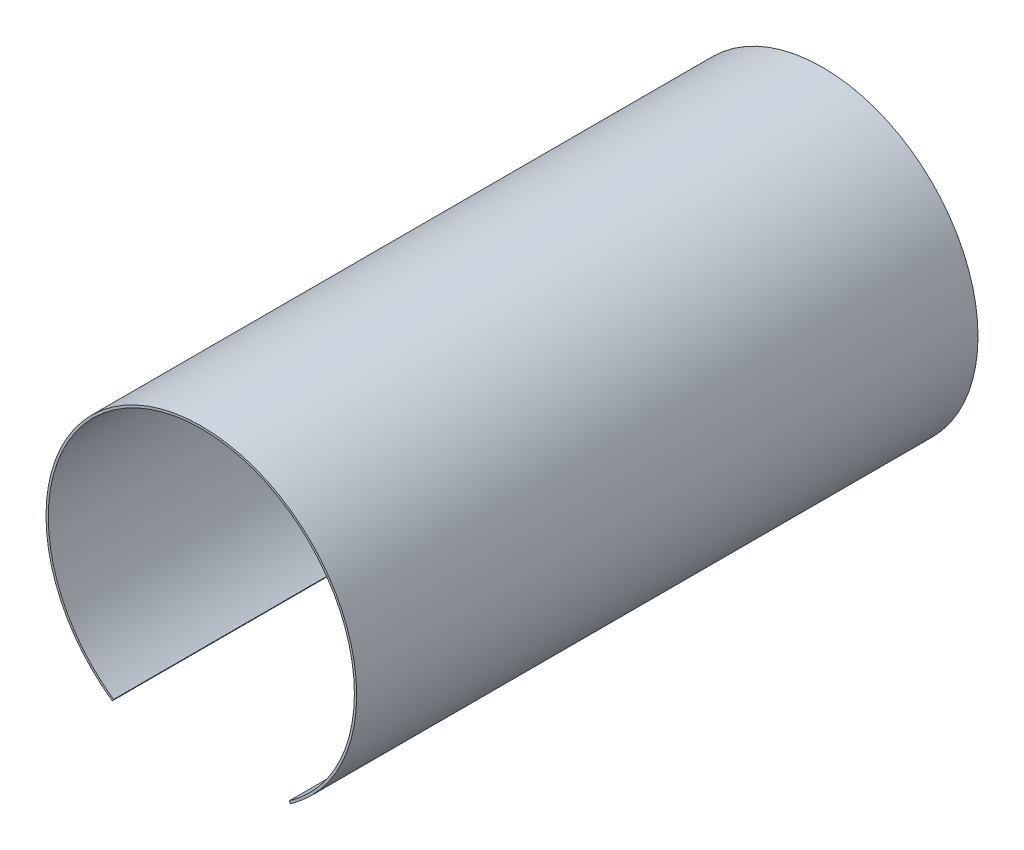
ISO-10303-21;
HEADER;
FILE_DESCRIPTION(('STEP AP214'),'2;1');
FILE_NAME('part.step','',(''),(''),'','','');
FILE_SCHEMA(('AUTOMOTIVE_DESIGN { 1 0 10303 214 1 1 1 1 }'));
ENDSEC;
DATA;
#1=APPLICATION_CONTEXT('core data for automotive mechanical design processes');
#2=APPLICATION_PROTOCOL_DEFINITION('international standard','automotive_design',2000,#1);
#3=PRODUCT_CONTEXT('',#1,'mechanical');
#4=PRODUCT('Part','Part','',(#3));
#5=PRODUCT_RELATED_PRODUCT_CATEGORY('part','',(#4));
#6=PRODUCT_DEFINITION_FORMATION('','',#4);
#7=PRODUCT_DEFINITION_CONTEXT('part definition',#1,'design');
#8=PRODUCT_DEFINITION('design','',#6,#7);
#9=PRODUCT_DEFINITION_SHAPE('','',#8);
#10=(LENGTH_UNIT() NAMED_UNIT(*) SI_UNIT(.MILLI.,.METRE.));
#11=(NAMED_UNIT(*) PLANE_ANGLE_UNIT() SI_UNIT($,.RADIAN.));
#12=(NAMED_UNIT(*) SI_UNIT($,.STERADIAN.) SOLID_ANGLE_UNIT());
#13=UNCERTAINTY_MEASURE_WITH_UNIT(LENGTH_MEASURE(1.E-05),#10,'distance_accuracy_value','');
#14=(GEOMETRIC_REPRESENTATION_CONTEXT(3) GLOBAL_UNCERTAINTY_ASSIGNED_CONTEXT((#13)) GLOBAL_UNIT_ASSIGNED_CONTEXT((#10,
#11,#12)) REPRESENTATION_CONTEXT('',''));
#15=CARTESIAN_POINT('',(0.,0.,0.));
#16=DIRECTION('',(0.,0.,1.));
#17=DIRECTION('',(1.,0.,0.));
#18=AXIS2_PLACEMENT_3D('',#15,#16,#17);
#19=CARTESIAN_POINT('',(0.,0.,410.));
#20=DIRECTION('',(0.,0.,-1.));
#21=DIRECTION('',(-1.,0.,0.));
#22=AXIS2_PLACEMENT_3D('',#19,#20,#21);
#23=CYLINDRICAL_SURFACE('',#22,101.);
#24=CARTESIAN_POINT('',(0.,0.,0.));
#25=DIRECTION('',(0.,0.,-1.));
#26=DIRECTION('',(-1.,0.,0.));
#27=AXIS2_PLACEMENT_3D('',#24,#25,#26);
#28=CIRCLE('',#27,101.);
#29=CARTESIAN_POINT('',(-57.9312200714552,-82.7343564731885,0.));
#30=VERTEX_POINT('',#29);
#31=CARTESIAN_POINT('',(57.9312200714552,-82.7343564731885,0.));
#32=VERTEX_POINT('',#31);
#33=EDGE_CURVE('E96',#30,#32,#28,.T.);
#34=ORIENTED_EDGE('',*,*,#33,.T.);
#35=DIRECTION('',(0.,0.,-1.));
#36=VECTOR('',#35,1.);
#37=CARTESIAN_POINT('',(57.9312200714552,-82.7343564731885,410.));
#38=LINE('',#37,#36);
#39=CARTESIAN_POINT('',(57.9312200714552,-82.7343564731885,410.));
#40=VERTEX_POINT('',#39);
#41=EDGE_CURVE('E11',#40,#32,#38,.T.);
#42=ORIENTED_EDGE('',*,*,#41,.F.);
#43=CARTESIAN_POINT('',(0.,0.,410.));
#44=DIRECTION('',(0.,0.,-1.));
#45=DIRECTION('',(-1.,0.,0.));
#46=AXIS2_PLACEMENT_3D('',#43,#44,#45);
#47=CIRCLE('',#46,101.);
#48=CARTESIAN_POINT('',(-57.9312200714552,-82.7343564731885,410.));
#49=VERTEX_POINT('',#48);
#50=EDGE_CURVE('E84',#49,#40,#47,.T.);
#51=ORIENTED_EDGE('',*,*,#50,.F.);
#52=DIRECTION('',(0.,0.,-1.));
#53=VECTOR('',#52,1.);
#54=CARTESIAN_POINT('',(-57.9312200714552,-82.7343564731885,410.));
#55=LINE('',#54,#53);
#56=EDGE_CURVE('E92',#49,#30,#55,.T.);
#57=ORIENTED_EDGE('',*,*,#56,.T.);
#58=EDGE_LOOP('',(#34,#42,#51,#57));
#59=FACE_BOUND('',#58,.T.);
#60=ADVANCED_FACE('F33',(#59),#23,.F.);
#61=CARTESIAN_POINT('',(57.9312200714552,-82.7343564731885,410.));
#62=DIRECTION('',(0.819152044288999,0.573576436351035,0.));
#63=DIRECTION('',(-0.573576436351035,0.819152044288999,0.));
#64=AXIS2_PLACEMENT_3D('',#61,#62,#63);
#65=PLANE('',#64);
#66=DIRECTION('',(0.573576436351035,-0.819152044288999,0.));
#67=VECTOR('',#66,1.);
#68=CARTESIAN_POINT('',(57.9312200714552,-82.7343564731885,0.));
#69=LINE('',#68,#67);
#70=CARTESIAN_POINT('',(58.7915847259817,-83.963084539622,0.));
#71=VERTEX_POINT('',#70);
#72=EDGE_CURVE('E88',#32,#71,#69,.T.);
#73=ORIENTED_EDGE('',*,*,#72,.T.);
#74=DIRECTION('',(0.,0.,-1.));
#75=VECTOR('',#74,1.);
#76=CARTESIAN_POINT('',(58.7915847259817,-83.963084539622,410.));
#77=LINE('',#76,#75);
#78=CARTESIAN_POINT('',(58.7915847259817,-83.963084539622,410.));
#79=VERTEX_POINT('',#78);
#80=EDGE_CURVE('E41',#79,#71,#77,.T.);
#81=ORIENTED_EDGE('',*,*,#80,.F.);
#82=DIRECTION('',(0.573576436351035,-0.819152044288999,0.));
#83=VECTOR('',#82,1.);
#84=CARTESIAN_POINT('',(57.9312200714552,-82.7343564731885,410.));
#85=LINE('',#84,#83);
#86=EDGE_CURVE('E79',#40,#79,#85,.T.);
#87=ORIENTED_EDGE('',*,*,#86,.F.);
#88=ORIENTED_EDGE('',*,*,#41,.T.);
#89=EDGE_LOOP('',(#73,#81,#87,#88));
#90=FACE_BOUND('',#89,.T.);
#91=ADVANCED_FACE('F87',(#90),#65,.F.);
#92=CARTESIAN_POINT('',(0.,0.,410.));
#93=DIRECTION('',(0.,0.,-1.));
#94=DIRECTION('',(-1.,0.,0.));
#95=AXIS2_PLACEMENT_3D('',#92,#93,#94);
#96=CYLINDRICAL_SURFACE('',#95,102.5);
#97=CARTESIAN_POINT('',(0.,0.,0.));
#98=DIRECTION('',(0.,0.,1.));
#99=DIRECTION('',(-1.,0.,0.));
#100=AXIS2_PLACEMENT_3D('',#97,#98,#99);
#101=CIRCLE('',#100,102.5);
#102=CARTESIAN_POINT('',(-58.7915847259818,-83.963084539622,0.));
#103=VERTEX_POINT('',#102);
#104=EDGE_CURVE('E66',#71,#103,#101,.T.);
#105=ORIENTED_EDGE('',*,*,#104,.T.);
#106=DIRECTION('',(0.,0.,-1.));
#107=VECTOR('',#106,1.);
#108=CARTESIAN_POINT('',(-58.7915847259818,-83.963084539622,410.));
#109=LINE('',#108,#107);
#110=CARTESIAN_POINT('',(-58.7915847259818,-83.963084539622,410.));
#111=VERTEX_POINT('',#110);
#112=EDGE_CURVE('E89',#111,#103,#109,.T.);
#113=ORIENTED_EDGE('',*,*,#112,.F.);
#114=CARTESIAN_POINT('',(0.,0.,410.));
#115=DIRECTION('',(0.,0.,1.));
#116=DIRECTION('',(-1.,0.,0.));
#117=AXIS2_PLACEMENT_3D('',#114,#115,#116);
#118=CIRCLE('',#117,102.5);
#119=EDGE_CURVE('E82',#79,#111,#118,.T.);
#120=ORIENTED_EDGE('',*,*,#119,.F.);
#121=ORIENTED_EDGE('',*,*,#80,.T.);
#122=EDGE_LOOP('',(#105,#113,#120,#121));
#123=FACE_BOUND('',#122,.T.);
#124=ADVANCED_FACE('F90',(#123),#96,.T.);
#125=CARTESIAN_POINT('',(-58.7915847259818,-83.963084539622,410.));
#126=DIRECTION('',(-0.81915204428899,0.573576436351049,0.));
#127=DIRECTION('',(-0.573576436351049,-0.81915204428899,0.));
#128=AXIS2_PLACEMENT_3D('',#125,#126,#127);
#129=PLANE('',#128);
#130=DIRECTION('',(0.573576436351049,0.81915204428899,0.));
#131=VECTOR('',#130,1.);
#132=CARTESIAN_POINT('',(-58.7915847259818,-83.963084539622,0.));
#133=LINE('',#132,#131);
#134=EDGE_CURVE('E72',#103,#30,#133,.T.);
#135=ORIENTED_EDGE('',*,*,#134,.T.);
#136=ORIENTED_EDGE('',*,*,#56,.F.);
#137=DIRECTION('',(0.573576436351049,0.81915204428899,0.));
#138=VECTOR('',#137,1.);
#139=CARTESIAN_POINT('',(-58.7915847259818,-83.963084539622,410.));
#140=LINE('',#139,#138);
#141=EDGE_CURVE('E49',#111,#49,#140,.T.);
#142=ORIENTED_EDGE('',*,*,#141,.F.);
#143=ORIENTED_EDGE('',*,*,#112,.T.);
#144=EDGE_LOOP('',(#135,#136,#142,#143));
#145=FACE_BOUND('',#144,.T.);
#146=ADVANCED_FACE('F103',(#145),#129,.F.);
#147=CARTESIAN_POINT('',(0.,0.,410.));
#148=DIRECTION('',(0.,0.,-1.));
#149=DIRECTION('',(-1.,0.,0.));
#150=AXIS2_PLACEMENT_3D('',#147,#148,#149);
#151=PLANE('',#150);
#152=ORIENTED_EDGE('',*,*,#50,.T.);
#153=ORIENTED_EDGE('',*,*,#86,.T.);
#154=ORIENTED_EDGE('',*,*,#119,.T.);
#155=ORIENTED_EDGE('',*,*,#141,.T.);
#156=EDGE_LOOP('',(#152,#153,#154,#155));
#157=FACE_BOUND('',#156,.T.);
#158=ADVANCED_FACE('F80',(#157),#151,.F.);
#159=CARTESIAN_POINT('',(0.,0.,0.));
#160=DIRECTION('',(0.,0.,-1.));
#161=DIRECTION('',(-1.,0.,0.));
#162=AXIS2_PLACEMENT_3D('',#159,#160,#161);
#163=PLANE('',#162);
#164=ORIENTED_EDGE('',*,*,#33,.F.);
#165=ORIENTED_EDGE('',*,*,#134,.F.);
#166=ORIENTED_EDGE('',*,*,#104,.F.);
#167=ORIENTED_EDGE('',*,*,#72,.F.);
#168=EDGE_LOOP('',(#164,#165,#166,#167));
#169=FACE_BOUND('',#168,.T.);
#170=ADVANCED_FACE('F106',(#169),#163,.T.);
#171=CLOSED_SHELL('',(#60,#91,#124,#146,#158,#170));
#172=MANIFOLD_SOLID_BREP('B2',#171);
#173=ADVANCED_BREP_SHAPE_REPRESENTATION('',(#18,#172),#14);
#174=SHAPE_DEFINITION_REPRESENTATION(#9,#173);
ENDSEC;
END-ISO-10303-21;
